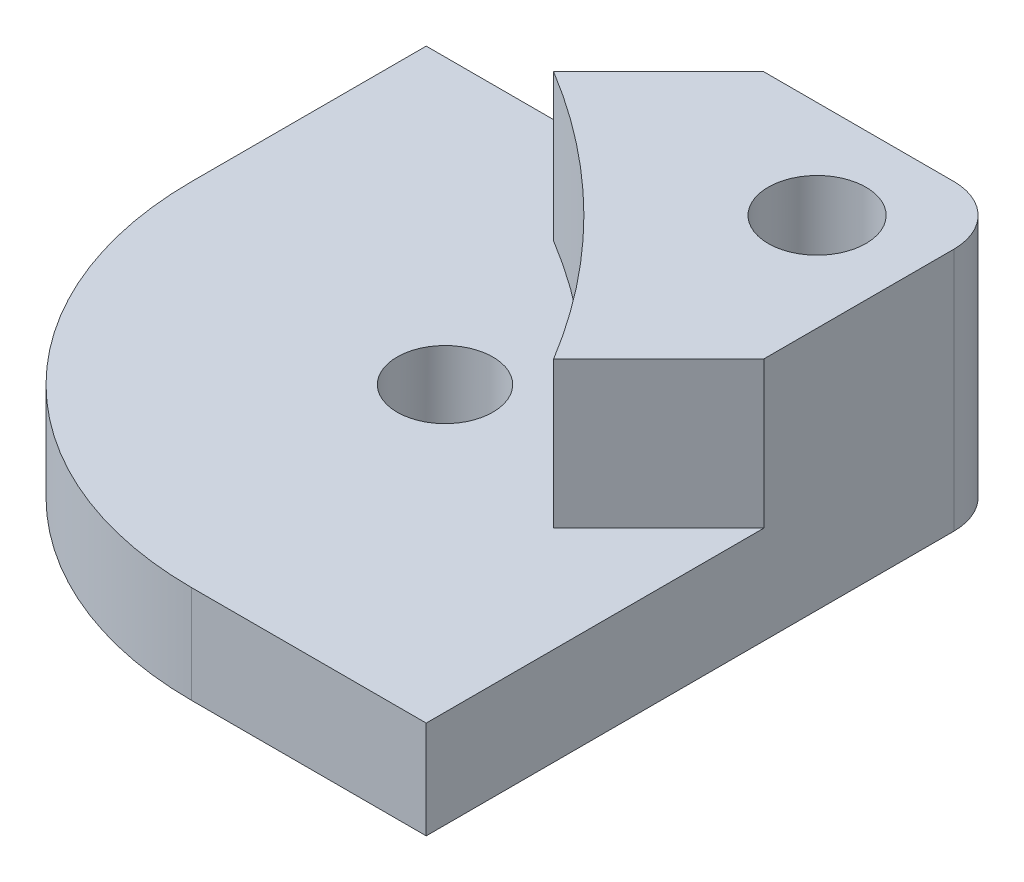
ISO-10303-21;
HEADER;
FILE_DESCRIPTION(('STEP AP214'),'2;1');
FILE_NAME('part.step','',(''),(''),'','','');
FILE_SCHEMA(('AUTOMOTIVE_DESIGN { 1 0 10303 214 1 1 1 1 }'));
ENDSEC;
DATA;
#1=APPLICATION_CONTEXT('core data for automotive mechanical design processes');
#2=APPLICATION_PROTOCOL_DEFINITION('international standard','automotive_design',2000,#1);
#3=PRODUCT_CONTEXT('',#1,'mechanical');
#4=PRODUCT('Part','Part','',(#3));
#5=PRODUCT_RELATED_PRODUCT_CATEGORY('part','',(#4));
#6=PRODUCT_DEFINITION_FORMATION('','',#4);
#7=PRODUCT_DEFINITION_CONTEXT('part definition',#1,'design');
#8=PRODUCT_DEFINITION('design','',#6,#7);
#9=PRODUCT_DEFINITION_SHAPE('','',#8);
#10=(LENGTH_UNIT() NAMED_UNIT(*) SI_UNIT(.MILLI.,.METRE.));
#11=(NAMED_UNIT(*) PLANE_ANGLE_UNIT() SI_UNIT($,.RADIAN.));
#12=(NAMED_UNIT(*) SI_UNIT($,.STERADIAN.) SOLID_ANGLE_UNIT());
#13=UNCERTAINTY_MEASURE_WITH_UNIT(LENGTH_MEASURE(1.E-05),#10,'distance_accuracy_value','');
#14=(GEOMETRIC_REPRESENTATION_CONTEXT(3) GLOBAL_UNCERTAINTY_ASSIGNED_CONTEXT((#13)) GLOBAL_UNIT_ASSIGNED_CONTEXT((#10,
#11,#12)) REPRESENTATION_CONTEXT('',''));
#15=CARTESIAN_POINT('',(0.,0.,0.));
#16=DIRECTION('',(0.,0.,1.));
#17=DIRECTION('',(1.,0.,0.));
#18=AXIS2_PLACEMENT_3D('',#15,#16,#17);
#19=CARTESIAN_POINT('',(95.25,12.7,95.25));
#20=DIRECTION('',(-1.,0.,0.));
#21=DIRECTION('',(0.,0.,1.));
#22=AXIS2_PLACEMENT_3D('',#19,#20,#21);
#23=PLANE('',#22);
#24=DIRECTION('',(0.,0.,-1.));
#25=VECTOR('',#24,1.);
#26=CARTESIAN_POINT('',(95.25,12.7,95.25));
#27=LINE('',#26,#25);
#28=CARTESIAN_POINT('',(95.2500000000001,12.7,-19.05));
#29=VERTEX_POINT('',#28);
#30=CARTESIAN_POINT('',(95.25,12.7,-62.9210779641511));
#31=VERTEX_POINT('',#30);
#32=EDGE_CURVE('E188',#29,#31,#27,.T.);
#33=ORIENTED_EDGE('',*,*,#32,.F.);
#34=DIRECTION('',(0.,1.,0.));
#35=VECTOR('',#34,1.);
#36=CARTESIAN_POINT('',(95.2500000000001,-107.76307345283,-19.05));
#37=LINE('',#36,#35);
#38=CARTESIAN_POINT('',(95.2500000000001,0.,-19.05));
#39=VERTEX_POINT('',#38);
#40=EDGE_CURVE('E157',#39,#29,#37,.T.);
#41=ORIENTED_EDGE('',*,*,#40,.F.);
#42=DIRECTION('',(0.,0.,-1.));
#43=VECTOR('',#42,1.);
#44=CARTESIAN_POINT('',(95.25,0.,95.25));
#45=LINE('',#44,#43);
#46=CARTESIAN_POINT('',(95.25,0.,-87.63));
#47=VERTEX_POINT('',#46);
#48=EDGE_CURVE('E173',#39,#47,#45,.T.);
#49=ORIENTED_EDGE('',*,*,#48,.T.);
#50=DIRECTION('',(0.,-1.,0.));
#51=VECTOR('',#50,1.);
#52=CARTESIAN_POINT('',(95.25,12.7,-87.63));
#53=LINE('',#52,#51);
#54=CARTESIAN_POINT('',(95.25,31.75,-87.63));
#55=VERTEX_POINT('',#54);
#56=EDGE_CURVE('E178',#47,#55,#53,.F.);
#57=ORIENTED_EDGE('',*,*,#56,.T.);
#58=DIRECTION('',(0.,0.,-1.));
#59=VECTOR('',#58,1.);
#60=CARTESIAN_POINT('',(95.25,31.75,0.));
#61=LINE('',#60,#59);
#62=CARTESIAN_POINT('',(95.25,31.75,-62.9210779641511));
#63=VERTEX_POINT('',#62);
#64=EDGE_CURVE('E213',#63,#55,#61,.T.);
#65=ORIENTED_EDGE('',*,*,#64,.F.);
#66=DIRECTION('',(0.,-1.,0.));
#67=VECTOR('',#66,1.);
#68=CARTESIAN_POINT('',(95.25,31.75,-62.9210779641511));
#69=LINE('',#68,#67);
#70=EDGE_CURVE('E180',#63,#31,#69,.T.);
#71=ORIENTED_EDGE('',*,*,#70,.T.);
#72=EDGE_LOOP('',(#33,#41,#49,#57,#65,#71));
#73=FACE_BOUND('',#72,.T.);
#74=ADVANCED_FACE('F36',(#73),#23,.F.);
#75=CARTESIAN_POINT('',(0.,12.7,0.));
#76=DIRECTION('',(0.,-1.,0.));
#77=DIRECTION('',(0.,0.,-1.));
#78=AXIS2_PLACEMENT_3D('',#75,#76,#77);
#79=PLANE('',#78);
#80=DIRECTION('',(-1.,0.,0.));
#81=VECTOR('',#80,1.);
#82=CARTESIAN_POINT('',(0.,12.7,-19.05));
#83=LINE('',#82,#81);
#84=CARTESIAN_POINT('',(64.7700000000001,12.7,-19.05));
#85=VERTEX_POINT('',#84);
#86=EDGE_CURVE('E160',#29,#85,#83,.T.);
#87=ORIENTED_EDGE('',*,*,#86,.F.);
#88=ORIENTED_EDGE('',*,*,#32,.T.);
#89=DIRECTION('',(0.707106781186547,0.,-0.707106781186548));
#90=VECTOR('',#89,1.);
#91=CARTESIAN_POINT('',(16.1644610179246,12.7,16.1644610179246));
#92=LINE('',#91,#90);
#93=CARTESIAN_POINT('',(81.5941319717433,12.7,-49.2652099358943));
#94=VERTEX_POINT('',#93);
#95=EDGE_CURVE('E193',#94,#31,#92,.T.);
#96=ORIENTED_EDGE('',*,*,#95,.F.);
#97=CARTESIAN_POINT('',(0.,12.7,0.));
#98=DIRECTION('',(0.,1.,0.));
#99=DIRECTION('',(0.,0.,1.));
#100=AXIS2_PLACEMENT_3D('',#97,#98,#99);
#101=CIRCLE('',#100,95.3135);
#102=CARTESIAN_POINT('',(49.2652099358943,12.7,-81.5941319717433));
#103=VERTEX_POINT('',#102);
#104=EDGE_CURVE('E187',#94,#103,#101,.T.);
#105=ORIENTED_EDGE('',*,*,#104,.T.);
#106=DIRECTION('',(-0.707106781186547,0.,0.707106781186548));
#107=VECTOR('',#106,1.);
#108=CARTESIAN_POINT('',(-16.1644610179244,12.7,-16.1644610179244));
#109=LINE('',#108,#107);
#110=CARTESIAN_POINT('',(62.9210779641511,12.7,-95.25));
#111=VERTEX_POINT('',#110);
#112=EDGE_CURVE('E192',#111,#103,#109,.T.);
#113=ORIENTED_EDGE('',*,*,#112,.F.);
#114=DIRECTION('',(-1.,0.,0.));
#115=VECTOR('',#114,1.);
#116=CARTESIAN_POINT('',(-95.25,12.7,-95.25));
#117=LINE('',#116,#115);
#118=CARTESIAN_POINT('',(19.05,12.7,-95.25));
#119=VERTEX_POINT('',#118);
#120=EDGE_CURVE('E185',#111,#119,#117,.T.);
#121=ORIENTED_EDGE('',*,*,#120,.T.);
#122=DIRECTION('',(0.,0.,1.));
#123=VECTOR('',#122,1.);
#124=CARTESIAN_POINT('',(19.05,12.7,0.));
#125=LINE('',#124,#123);
#126=CARTESIAN_POINT('',(19.05,12.7,-64.77));
#127=VERTEX_POINT('',#126);
#128=EDGE_CURVE('E152',#119,#127,#125,.T.);
#129=ORIENTED_EDGE('',*,*,#128,.T.);
#130=CARTESIAN_POINT('',(64.7700000000001,12.7,-64.77));
#131=DIRECTION('',(0.,1.,0.));
#132=DIRECTION('',(0.,0.,1.));
#133=AXIS2_PLACEMENT_3D('',#130,#131,#132);
#134=CIRCLE('',#133,45.72);
#135=EDGE_CURVE('E143',#127,#85,#134,.T.);
#136=ORIENTED_EDGE('',*,*,#135,.T.);
#137=EDGE_LOOP('',(#87,#88,#96,#105,#113,#121,#129,#136));
#138=FACE_BOUND('',#137,.T.);
#139=CARTESIAN_POINT('',(58.3716647869505,12.7,-58.371664786952));
#140=DIRECTION('',(0.,1.,0.));
#141=DIRECTION('',(0.,0.,1.));
#142=AXIS2_PLACEMENT_3D('',#139,#140,#141);
#143=CIRCLE('',#142,6.22300000000001);
#144=CARTESIAN_POINT('',(58.3716647869505,12.7,-52.148664786952));
#145=VERTEX_POINT('',#144);
#146=EDGE_CURVE('E11',#145,#145,#143,.T.);
#147=ORIENTED_EDGE('',*,*,#146,.F.);
#148=EDGE_LOOP('',(#147));
#149=FACE_BOUND('',#148,.T.);
#150=ADVANCED_FACE('F241',(#138,#149),#79,.F.);
#151=CARTESIAN_POINT('',(-95.25,12.7,-95.25));
#152=DIRECTION('',(0.,0.,1.));
#153=DIRECTION('',(1.,0.,0.));
#154=AXIS2_PLACEMENT_3D('',#151,#152,#153);
#155=PLANE('',#154);
#156=DIRECTION('',(-1.,0.,0.));
#157=VECTOR('',#156,1.);
#158=CARTESIAN_POINT('',(-95.25,0.,-95.25));
#159=LINE('',#158,#157);
#160=CARTESIAN_POINT('',(87.63,0.,-95.25));
#161=VERTEX_POINT('',#160);
#162=CARTESIAN_POINT('',(19.05,0.,-95.25));
#163=VERTEX_POINT('',#162);
#164=EDGE_CURVE('E40',#161,#163,#159,.T.);
#165=ORIENTED_EDGE('',*,*,#164,.T.);
#166=DIRECTION('',(0.,1.,0.));
#167=VECTOR('',#166,1.);
#168=CARTESIAN_POINT('',(19.05,-107.76307345283,-95.25));
#169=LINE('',#168,#167);
#170=EDGE_CURVE('E150',#163,#119,#169,.T.);
#171=ORIENTED_EDGE('',*,*,#170,.T.);
#172=ORIENTED_EDGE('',*,*,#120,.F.);
#173=DIRECTION('',(0.,-1.,0.));
#174=VECTOR('',#173,1.);
#175=CARTESIAN_POINT('',(62.9210779641511,31.75,-95.25));
#176=LINE('',#175,#174);
#177=CARTESIAN_POINT('',(62.9210779641511,31.75,-95.25));
#178=VERTEX_POINT('',#177);
#179=EDGE_CURVE('E196',#178,#111,#176,.T.);
#180=ORIENTED_EDGE('',*,*,#179,.F.);
#181=DIRECTION('',(-1.,0.,0.));
#182=VECTOR('',#181,1.);
#183=CARTESIAN_POINT('',(0.,31.75,-95.25));
#184=LINE('',#183,#182);
#185=CARTESIAN_POINT('',(87.63,31.75,-95.25));
#186=VERTEX_POINT('',#185);
#187=EDGE_CURVE('E208',#186,#178,#184,.T.);
#188=ORIENTED_EDGE('',*,*,#187,.F.);
#189=DIRECTION('',(0.,-1.,0.));
#190=VECTOR('',#189,1.);
#191=CARTESIAN_POINT('',(87.63,12.7,-95.25));
#192=LINE('',#191,#190);
#193=EDGE_CURVE('E183',#186,#161,#192,.T.);
#194=ORIENTED_EDGE('',*,*,#193,.T.);
#195=EDGE_LOOP('',(#165,#171,#172,#180,#188,#194));
#196=FACE_BOUND('',#195,.T.);
#197=ADVANCED_FACE('F38',(#196),#155,.F.);
#198=CARTESIAN_POINT('',(0.,0.,0.));
#199=DIRECTION('',(0.,-1.,0.));
#200=DIRECTION('',(0.,0.,-1.));
#201=AXIS2_PLACEMENT_3D('',#198,#199,#200);
#202=PLANE('',#201);
#203=CARTESIAN_POINT('',(82.55,0.,-82.55));
#204=DIRECTION('',(0.,1.,0.));
#205=DIRECTION('',(0.,0.,1.));
#206=AXIS2_PLACEMENT_3D('',#203,#204,#205);
#207=CIRCLE('',#206,3.2385);
#208=CARTESIAN_POINT('',(82.55,0.,-79.3115));
#209=VERTEX_POINT('',#208);
#210=EDGE_CURVE('E163',#209,#209,#207,.T.);
#211=ORIENTED_EDGE('',*,*,#210,.T.);
#212=EDGE_LOOP('',(#211));
#213=FACE_BOUND('',#212,.T.);
#214=ORIENTED_EDGE('',*,*,#48,.F.);
#215=DIRECTION('',(-1.,0.,0.));
#216=VECTOR('',#215,1.);
#217=CARTESIAN_POINT('',(0.,0.,-19.05));
#218=LINE('',#217,#216);
#219=CARTESIAN_POINT('',(64.7700000000001,0.,-19.05));
#220=VERTEX_POINT('',#219);
#221=EDGE_CURVE('E134',#39,#220,#218,.T.);
#222=ORIENTED_EDGE('',*,*,#221,.T.);
#223=CARTESIAN_POINT('',(64.7700000000001,0.,-64.77));
#224=DIRECTION('',(0.,-1.,0.));
#225=DIRECTION('',(0.,0.,-1.));
#226=AXIS2_PLACEMENT_3D('',#223,#224,#225);
#227=CIRCLE('',#226,45.72);
#228=CARTESIAN_POINT('',(19.05,0.,-64.77));
#229=VERTEX_POINT('',#228);
#230=EDGE_CURVE('E125',#229,#220,#227,.F.);
#231=ORIENTED_EDGE('',*,*,#230,.F.);
#232=DIRECTION('',(0.,0.,1.));
#233=VECTOR('',#232,1.);
#234=CARTESIAN_POINT('',(19.05,0.,0.));
#235=LINE('',#234,#233);
#236=EDGE_CURVE('E131',#163,#229,#235,.T.);
#237=ORIENTED_EDGE('',*,*,#236,.F.);
#238=ORIENTED_EDGE('',*,*,#164,.F.);
#239=CARTESIAN_POINT('',(87.63,0.,-87.63));
#240=DIRECTION('',(0.,-1.,0.));
#241=DIRECTION('',(0.,0.,-1.));
#242=AXIS2_PLACEMENT_3D('',#239,#240,#241);
#243=CIRCLE('',#242,7.62);
#244=EDGE_CURVE('E86',#161,#47,#243,.T.);
#245=ORIENTED_EDGE('',*,*,#244,.T.);
#246=EDGE_LOOP('',(#214,#222,#231,#237,#238,#245));
#247=FACE_BOUND('',#246,.T.);
#248=CARTESIAN_POINT('',(58.3716647869505,0.,-58.371664786952));
#249=DIRECTION('',(0.,-1.,0.));
#250=DIRECTION('',(0.,0.,-1.));
#251=AXIS2_PLACEMENT_3D('',#248,#249,#250);
#252=CIRCLE('',#251,6.22300000000001);
#253=CARTESIAN_POINT('',(58.3716647869505,0.,-64.594664786952));
#254=VERTEX_POINT('',#253);
#255=EDGE_CURVE('E46',#254,#254,#252,.T.);
#256=ORIENTED_EDGE('',*,*,#255,.F.);
#257=EDGE_LOOP('',(#256));
#258=FACE_BOUND('',#257,.T.);
#259=ADVANCED_FACE('F127',(#213,#247,#258),#202,.T.);
#260=CARTESIAN_POINT('',(87.63,12.7,-87.63));
#261=DIRECTION('',(0.,-1.,0.));
#262=DIRECTION('',(0.,0.,-1.));
#263=AXIS2_PLACEMENT_3D('',#260,#261,#262);
#264=CYLINDRICAL_SURFACE('',#263,7.62);
#265=ORIENTED_EDGE('',*,*,#193,.F.);
#266=CARTESIAN_POINT('',(87.63,31.75,-87.63));
#267=DIRECTION('',(0.,1.,0.));
#268=DIRECTION('',(0.,0.,1.));
#269=AXIS2_PLACEMENT_3D('',#266,#267,#268);
#270=CIRCLE('',#269,7.62);
#271=EDGE_CURVE('E210',#55,#186,#270,.T.);
#272=ORIENTED_EDGE('',*,*,#271,.F.);
#273=ORIENTED_EDGE('',*,*,#56,.F.);
#274=ORIENTED_EDGE('',*,*,#244,.F.);
#275=EDGE_LOOP('',(#265,#272,#273,#274));
#276=FACE_BOUND('',#275,.T.);
#277=ADVANCED_FACE('F220',(#276),#264,.T.);
#278=CARTESIAN_POINT('',(0.,31.75,0.));
#279=DIRECTION('',(0.,-1.,0.));
#280=DIRECTION('',(0.,0.,-1.));
#281=AXIS2_PLACEMENT_3D('',#278,#279,#280);
#282=CYLINDRICAL_SURFACE('',#281,95.3135);
#283=ORIENTED_EDGE('',*,*,#104,.F.);
#284=DIRECTION('',(0.,-1.,0.));
#285=VECTOR('',#284,1.);
#286=CARTESIAN_POINT('',(81.5941319717433,31.75,-49.2652099358943));
#287=LINE('',#286,#285);
#288=CARTESIAN_POINT('',(81.5941319717433,31.75,-49.2652099358943));
#289=VERTEX_POINT('',#288);
#290=EDGE_CURVE('E81',#289,#94,#287,.T.);
#291=ORIENTED_EDGE('',*,*,#290,.F.);
#292=CARTESIAN_POINT('',(0.,31.75,0.));
#293=DIRECTION('',(0.,1.,0.));
#294=DIRECTION('',(0.,0.,1.));
#295=AXIS2_PLACEMENT_3D('',#292,#293,#294);
#296=CIRCLE('',#295,95.3135);
#297=CARTESIAN_POINT('',(49.2652099358943,31.75,-81.5941319717433));
#298=VERTEX_POINT('',#297);
#299=EDGE_CURVE('E182',#289,#298,#296,.T.);
#300=ORIENTED_EDGE('',*,*,#299,.T.);
#301=DIRECTION('',(0.,-1.,0.));
#302=VECTOR('',#301,1.);
#303=CARTESIAN_POINT('',(49.2652099358943,31.75,-81.5941319717433));
#304=LINE('',#303,#302);
#305=EDGE_CURVE('E199',#298,#103,#304,.T.);
#306=ORIENTED_EDGE('',*,*,#305,.T.);
#307=EDGE_LOOP('',(#283,#291,#300,#306));
#308=FACE_BOUND('',#307,.T.);
#309=ADVANCED_FACE('F228',(#308),#282,.F.);
#310=CARTESIAN_POINT('',(16.1644610179246,31.75,16.1644610179246));
#311=DIRECTION('',(-0.707106781186548,0.,-0.707106781186547));
#312=DIRECTION('',(-0.707106781186547,0.,0.707106781186548));
#313=AXIS2_PLACEMENT_3D('',#310,#311,#312);
#314=PLANE('',#313);
#315=ORIENTED_EDGE('',*,*,#95,.T.);
#316=ORIENTED_EDGE('',*,*,#70,.F.);
#317=DIRECTION('',(0.707106781186547,0.,-0.707106781186548));
#318=VECTOR('',#317,1.);
#319=CARTESIAN_POINT('',(16.1644610179246,31.75,16.1644610179246));
#320=LINE('',#319,#318);
#321=EDGE_CURVE('E74',#289,#63,#320,.T.);
#322=ORIENTED_EDGE('',*,*,#321,.F.);
#323=ORIENTED_EDGE('',*,*,#290,.T.);
#324=EDGE_LOOP('',(#315,#316,#322,#323));
#325=FACE_BOUND('',#324,.T.);
#326=ADVANCED_FACE('F230',(#325),#314,.F.);
#327=CARTESIAN_POINT('',(-16.1644610179244,31.75,-16.1644610179244));
#328=DIRECTION('',(0.707106781186548,0.,0.707106781186547));
#329=DIRECTION('',(0.707106781186547,0.,-0.707106781186548));
#330=AXIS2_PLACEMENT_3D('',#327,#328,#329);
#331=PLANE('',#330);
#332=ORIENTED_EDGE('',*,*,#112,.T.);
#333=ORIENTED_EDGE('',*,*,#305,.F.);
#334=DIRECTION('',(-0.707106781186547,0.,0.707106781186548));
#335=VECTOR('',#334,1.);
#336=CARTESIAN_POINT('',(-16.1644610179244,31.75,-16.1644610179244));
#337=LINE('',#336,#335);
#338=EDGE_CURVE('E55',#178,#298,#337,.T.);
#339=ORIENTED_EDGE('',*,*,#338,.F.);
#340=ORIENTED_EDGE('',*,*,#179,.T.);
#341=EDGE_LOOP('',(#332,#333,#339,#340));
#342=FACE_BOUND('',#341,.T.);
#343=ADVANCED_FACE('F227',(#342),#331,.F.);
#344=CARTESIAN_POINT('',(0.,31.75,0.));
#345=DIRECTION('',(0.,1.,0.));
#346=DIRECTION('',(0.,0.,1.));
#347=AXIS2_PLACEMENT_3D('',#344,#345,#346);
#348=PLANE('',#347);
#349=CARTESIAN_POINT('',(82.55,31.75,-82.55));
#350=DIRECTION('',(0.,1.,0.));
#351=DIRECTION('',(0.,0.,1.));
#352=AXIS2_PLACEMENT_3D('',#349,#350,#351);
#353=CIRCLE('',#352,6.34999999999999);
#354=CARTESIAN_POINT('',(82.55,31.75,-76.2));
#355=VERTEX_POINT('',#354);
#356=EDGE_CURVE('E170',#355,#355,#353,.T.);
#357=ORIENTED_EDGE('',*,*,#356,.F.);
#358=EDGE_LOOP('',(#357));
#359=FACE_BOUND('',#358,.T.);
#360=ORIENTED_EDGE('',*,*,#299,.F.);
#361=ORIENTED_EDGE('',*,*,#321,.T.);
#362=ORIENTED_EDGE('',*,*,#64,.T.);
#363=ORIENTED_EDGE('',*,*,#271,.T.);
#364=ORIENTED_EDGE('',*,*,#187,.T.);
#365=ORIENTED_EDGE('',*,*,#338,.T.);
#366=EDGE_LOOP('',(#360,#361,#362,#363,#364,#365));
#367=FACE_BOUND('',#366,.T.);
#368=ADVANCED_FACE('F222',(#359,#367),#348,.T.);
#369=CARTESIAN_POINT('',(58.3716647869505,-12.7,-58.371664786952));
#370=DIRECTION('',(0.,1.,0.));
#371=DIRECTION('',(0.,0.,1.));
#372=AXIS2_PLACEMENT_3D('',#369,#370,#371);
#373=CYLINDRICAL_SURFACE('',#372,6.22300000000001);
#374=ORIENTED_EDGE('',*,*,#255,.T.);
#375=EDGE_LOOP('',(#374));
#376=FACE_BOUND('',#375,.T.);
#377=ORIENTED_EDGE('',*,*,#146,.T.);
#378=EDGE_LOOP('',(#377));
#379=FACE_BOUND('',#378,.T.);
#380=ADVANCED_FACE('F248',(#376,#379),#373,.F.);
#381=CARTESIAN_POINT('',(82.55,-5.26051224213829,-82.55));
#382=DIRECTION('',(0.,1.,0.));
#383=DIRECTION('',(0.,0.,1.));
#384=AXIS2_PLACEMENT_3D('',#381,#382,#383);
#385=CYLINDRICAL_SURFACE('',#384,6.34999999999999);
#386=ORIENTED_EDGE('',*,*,#356,.T.);
#387=EDGE_LOOP('',(#386));
#388=FACE_BOUND('',#387,.T.);
#389=CARTESIAN_POINT('',(82.55,12.7,-82.55));
#390=DIRECTION('',(0.,-1.,0.));
#391=DIRECTION('',(0.,0.,-1.));
#392=AXIS2_PLACEMENT_3D('',#389,#390,#391);
#393=CIRCLE('',#392,6.34999999999999);
#394=CARTESIAN_POINT('',(82.55,12.7,-88.9));
#395=VERTEX_POINT('',#394);
#396=EDGE_CURVE('E169',#395,#395,#393,.F.);
#397=ORIENTED_EDGE('',*,*,#396,.F.);
#398=EDGE_LOOP('',(#397));
#399=FACE_BOUND('',#398,.T.);
#400=ADVANCED_FACE('F265',(#388,#399),#385,.F.);
#401=CARTESIAN_POINT('',(0.,12.7,0.));
#402=DIRECTION('',(0.,-1.,0.));
#403=DIRECTION('',(0.,0.,-1.));
#404=AXIS2_PLACEMENT_3D('',#401,#402,#403);
#405=PLANE('',#404);
#406=ORIENTED_EDGE('',*,*,#396,.T.);
#407=EDGE_LOOP('',(#406));
#408=FACE_BOUND('',#407,.T.);
#409=CARTESIAN_POINT('',(82.55,12.7,-82.55));
#410=DIRECTION('',(0.,-1.,0.));
#411=DIRECTION('',(0.,0.,-1.));
#412=AXIS2_PLACEMENT_3D('',#409,#410,#411);
#413=CIRCLE('',#412,3.2385);
#414=CARTESIAN_POINT('',(82.55,12.7,-85.7885));
#415=VERTEX_POINT('',#414);
#416=EDGE_CURVE('E166',#415,#415,#413,.T.);
#417=ORIENTED_EDGE('',*,*,#416,.T.);
#418=EDGE_LOOP('',(#417));
#419=FACE_BOUND('',#418,.T.);
#420=ADVANCED_FACE('F260',(#408,#419),#405,.F.);
#421=CARTESIAN_POINT('',(82.55,0.,-82.55));
#422=DIRECTION('',(0.,1.,0.));
#423=DIRECTION('',(0.,0.,1.));
#424=AXIS2_PLACEMENT_3D('',#421,#422,#423);
#425=CYLINDRICAL_SURFACE('',#424,3.2385);
#426=ORIENTED_EDGE('',*,*,#210,.F.);
#427=EDGE_LOOP('',(#426));
#428=FACE_BOUND('',#427,.T.);
#429=ORIENTED_EDGE('',*,*,#416,.F.);
#430=EDGE_LOOP('',(#429));
#431=FACE_BOUND('',#430,.T.);
#432=ADVANCED_FACE('F257',(#428,#431),#425,.F.);
#433=CARTESIAN_POINT('',(19.05,-107.76307345283,0.));
#434=DIRECTION('',(-1.,0.,0.));
#435=DIRECTION('',(0.,0.,1.));
#436=AXIS2_PLACEMENT_3D('',#433,#434,#435);
#437=PLANE('',#436);
#438=ORIENTED_EDGE('',*,*,#170,.F.);
#439=ORIENTED_EDGE('',*,*,#236,.T.);
#440=DIRECTION('',(0.,1.,0.));
#441=VECTOR('',#440,1.);
#442=CARTESIAN_POINT('',(19.05,-107.76307345283,-64.77));
#443=LINE('',#442,#441);
#444=EDGE_CURVE('E138',#229,#127,#443,.T.);
#445=ORIENTED_EDGE('',*,*,#444,.T.);
#446=ORIENTED_EDGE('',*,*,#128,.F.);
#447=EDGE_LOOP('',(#438,#439,#445,#446));
#448=FACE_BOUND('',#447,.T.);
#449=ADVANCED_FACE('F148',(#448),#437,.T.);
#450=CARTESIAN_POINT('',(64.7700000000001,-107.76307345283,-64.77));
#451=DIRECTION('',(0.,1.,0.));
#452=DIRECTION('',(0.,0.,1.));
#453=AXIS2_PLACEMENT_3D('',#450,#451,#452);
#454=CYLINDRICAL_SURFACE('',#453,45.72);
#455=ORIENTED_EDGE('',*,*,#444,.F.);
#456=ORIENTED_EDGE('',*,*,#230,.T.);
#457=DIRECTION('',(0.,1.,0.));
#458=VECTOR('',#457,1.);
#459=CARTESIAN_POINT('',(64.7700000000001,-107.76307345283,-19.05));
#460=LINE('',#459,#458);
#461=EDGE_CURVE('E137',#220,#85,#460,.T.);
#462=ORIENTED_EDGE('',*,*,#461,.T.);
#463=ORIENTED_EDGE('',*,*,#135,.F.);
#464=EDGE_LOOP('',(#455,#456,#462,#463));
#465=FACE_BOUND('',#464,.T.);
#466=ADVANCED_FACE('F141',(#465),#454,.T.);
#467=CARTESIAN_POINT('',(0.,-107.76307345283,-19.05));
#468=DIRECTION('',(0.,0.,-1.));
#469=DIRECTION('',(-1.,0.,0.));
#470=AXIS2_PLACEMENT_3D('',#467,#468,#469);
#471=PLANE('',#470);
#472=ORIENTED_EDGE('',*,*,#221,.F.);
#473=ORIENTED_EDGE('',*,*,#40,.T.);
#474=ORIENTED_EDGE('',*,*,#86,.T.);
#475=ORIENTED_EDGE('',*,*,#461,.F.);
#476=EDGE_LOOP('',(#472,#473,#474,#475));
#477=FACE_BOUND('',#476,.T.);
#478=ADVANCED_FACE('F278',(#477),#471,.F.);
#479=CLOSED_SHELL('',(#74,#150,#197,#259,#277,#309,#326,#343,#368,#380,#400,#420,#432,#449,#466,#478));
#480=MANIFOLD_SOLID_BREP('B2',#479);
#481=ADVANCED_BREP_SHAPE_REPRESENTATION('',(#18,#480),#14);
#482=SHAPE_DEFINITION_REPRESENTATION(#9,#481);
ENDSEC;
END-ISO-10303-21;
